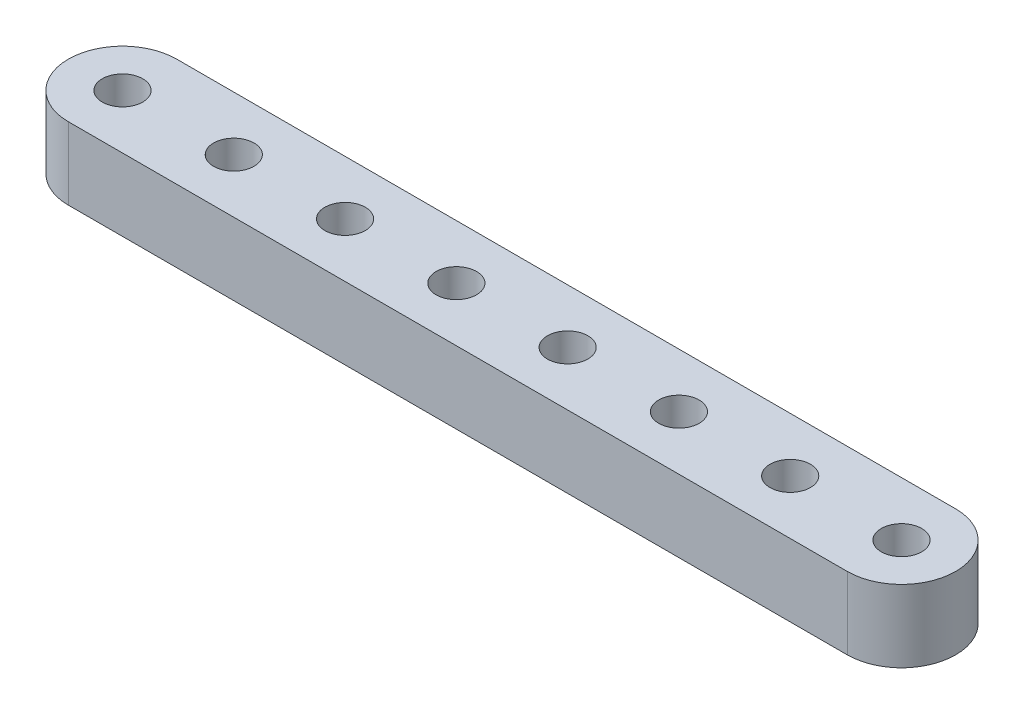
ISO-10303-21;
HEADER;
FILE_DESCRIPTION(('STEP AP214'),'2;1');
FILE_NAME('part.step','',(''),(''),'','','');
FILE_SCHEMA(('AUTOMOTIVE_DESIGN { 1 0 10303 214 1 1 1 1 }'));
ENDSEC;
DATA;
#1=APPLICATION_CONTEXT('core data for automotive mechanical design processes');
#2=APPLICATION_PROTOCOL_DEFINITION('international standard','automotive_design',2000,#1);
#3=PRODUCT_CONTEXT('',#1,'mechanical');
#4=PRODUCT('Part','Part','',(#3));
#5=PRODUCT_RELATED_PRODUCT_CATEGORY('part','',(#4));
#6=PRODUCT_DEFINITION_FORMATION('','',#4);
#7=PRODUCT_DEFINITION_CONTEXT('part definition',#1,'design');
#8=PRODUCT_DEFINITION('design','',#6,#7);
#9=PRODUCT_DEFINITION_SHAPE('','',#8);
#10=(LENGTH_UNIT() NAMED_UNIT(*) SI_UNIT(.MILLI.,.METRE.));
#11=(NAMED_UNIT(*) PLANE_ANGLE_UNIT() SI_UNIT($,.RADIAN.));
#12=(NAMED_UNIT(*) SI_UNIT($,.STERADIAN.) SOLID_ANGLE_UNIT());
#13=UNCERTAINTY_MEASURE_WITH_UNIT(LENGTH_MEASURE(1.E-05),#10,'distance_accuracy_value','');
#14=(GEOMETRIC_REPRESENTATION_CONTEXT(3) GLOBAL_UNCERTAINTY_ASSIGNED_CONTEXT((#13)) GLOBAL_UNIT_ASSIGNED_CONTEXT((#10,
#11,#12)) REPRESENTATION_CONTEXT('',''));
#15=CARTESIAN_POINT('',(0.,0.,0.));
#16=DIRECTION('',(0.,0.,1.));
#17=DIRECTION('',(1.,0.,0.));
#18=AXIS2_PLACEMENT_3D('',#15,#16,#17);
#19=CARTESIAN_POINT('',(39.116,6.35,4.76250000000001));
#20=DIRECTION('',(0.,0.,1.));
#21=DIRECTION('',(1.,0.,0.));
#22=AXIS2_PLACEMENT_3D('',#19,#20,#21);
#23=PLANE('',#22);
#24=DIRECTION('',(-1.,0.,0.));
#25=VECTOR('',#24,1.);
#26=CARTESIAN_POINT('',(39.116,6.35,4.76250000000001));
#27=LINE('',#26,#25);
#28=CARTESIAN_POINT('',(39.116,6.35,4.76250000000002));
#29=VERTEX_POINT('',#28);
#30=CARTESIAN_POINT('',(-29.337,6.35,4.76250000000001));
#31=VERTEX_POINT('',#30);
#32=EDGE_CURVE('E105',#29,#31,#27,.T.);
#33=ORIENTED_EDGE('',*,*,#32,.T.);
#34=DIRECTION('',(0.,1.,0.));
#35=VECTOR('',#34,1.);
#36=CARTESIAN_POINT('',(-29.337,0.,4.76250000000001));
#37=LINE('',#36,#35);
#38=CARTESIAN_POINT('',(-29.337,0.,4.76250000000001));
#39=VERTEX_POINT('',#38);
#40=EDGE_CURVE('E11',#31,#39,#37,.F.);
#41=ORIENTED_EDGE('',*,*,#40,.T.);
#42=DIRECTION('',(-1.,0.,0.));
#43=VECTOR('',#42,1.);
#44=CARTESIAN_POINT('',(39.116,0.,4.76250000000001));
#45=LINE('',#44,#43);
#46=CARTESIAN_POINT('',(39.116,0.,4.76250000000002));
#47=VERTEX_POINT('',#46);
#48=EDGE_CURVE('E96',#47,#39,#45,.T.);
#49=ORIENTED_EDGE('',*,*,#48,.F.);
#50=DIRECTION('',(0.,-1.,0.));
#51=VECTOR('',#50,1.);
#52=CARTESIAN_POINT('',(39.116,6.35,4.76250000000002));
#53=LINE('',#52,#51);
#54=EDGE_CURVE('E104',#29,#47,#53,.T.);
#55=ORIENTED_EDGE('',*,*,#54,.F.);
#56=EDGE_LOOP('',(#33,#41,#49,#55));
#57=FACE_BOUND('',#56,.T.);
#58=ADVANCED_FACE('F39',(#57),#23,.T.);
#59=CARTESIAN_POINT('',(39.116,6.35,0.));
#60=DIRECTION('',(0.,-1.,0.));
#61=DIRECTION('',(0.,0.,-1.));
#62=AXIS2_PLACEMENT_3D('',#59,#60,#61);
#63=CYLINDRICAL_SURFACE('',#62,4.76250000000001);
#64=CARTESIAN_POINT('',(39.116,0.,0.));
#65=DIRECTION('',(0.,-1.,0.));
#66=DIRECTION('',(0.,0.,-1.));
#67=AXIS2_PLACEMENT_3D('',#64,#65,#66);
#68=CIRCLE('',#67,4.76250000000001);
#69=CARTESIAN_POINT('',(39.116,0.,-4.76250000000001));
#70=VERTEX_POINT('',#69);
#71=EDGE_CURVE('E102',#70,#47,#68,.T.);
#72=ORIENTED_EDGE('',*,*,#71,.F.);
#73=DIRECTION('',(0.,-1.,0.));
#74=VECTOR('',#73,1.);
#75=CARTESIAN_POINT('',(39.116,6.35,-4.76250000000001));
#76=LINE('',#75,#74);
#77=CARTESIAN_POINT('',(39.116,6.35,-4.76250000000001));
#78=VERTEX_POINT('',#77);
#79=EDGE_CURVE('E89',#78,#70,#76,.T.);
#80=ORIENTED_EDGE('',*,*,#79,.F.);
#81=CARTESIAN_POINT('',(39.116,6.35,0.));
#82=DIRECTION('',(0.,-1.,0.));
#83=DIRECTION('',(0.,0.,-1.));
#84=AXIS2_PLACEMENT_3D('',#81,#82,#83);
#85=CIRCLE('',#84,4.76250000000001);
#86=EDGE_CURVE('E95',#78,#29,#85,.T.);
#87=ORIENTED_EDGE('',*,*,#86,.T.);
#88=ORIENTED_EDGE('',*,*,#54,.T.);
#89=EDGE_LOOP('',(#72,#80,#87,#88));
#90=FACE_BOUND('',#89,.T.);
#91=ADVANCED_FACE('F100',(#90),#63,.T.);
#92=CARTESIAN_POINT('',(-39.116,6.35,-4.76250000000001));
#93=DIRECTION('',(0.,0.,-1.));
#94=DIRECTION('',(-1.,0.,0.));
#95=AXIS2_PLACEMENT_3D('',#92,#93,#94);
#96=PLANE('',#95);
#97=DIRECTION('',(1.,0.,0.));
#98=VECTOR('',#97,1.);
#99=CARTESIAN_POINT('',(-39.116,0.,-4.76250000000001));
#100=LINE('',#99,#98);
#101=CARTESIAN_POINT('',(-29.337,0.,-4.76250000000001));
#102=VERTEX_POINT('',#101);
#103=EDGE_CURVE('E114',#102,#70,#100,.T.);
#104=ORIENTED_EDGE('',*,*,#103,.F.);
#105=DIRECTION('',(0.,-1.,0.));
#106=VECTOR('',#105,1.);
#107=CARTESIAN_POINT('',(-29.337,6.35,-4.76250000000001));
#108=LINE('',#107,#106);
#109=CARTESIAN_POINT('',(-29.337,6.35,-4.76250000000001));
#110=VERTEX_POINT('',#109);
#111=EDGE_CURVE('E92',#102,#110,#108,.F.);
#112=ORIENTED_EDGE('',*,*,#111,.T.);
#113=DIRECTION('',(1.,0.,0.));
#114=VECTOR('',#113,1.);
#115=CARTESIAN_POINT('',(-39.116,6.35,-4.76250000000001));
#116=LINE('',#115,#114);
#117=EDGE_CURVE('E85',#110,#78,#116,.T.);
#118=ORIENTED_EDGE('',*,*,#117,.T.);
#119=ORIENTED_EDGE('',*,*,#79,.T.);
#120=EDGE_LOOP('',(#104,#112,#118,#119));
#121=FACE_BOUND('',#120,.T.);
#122=ADVANCED_FACE('F88',(#121),#96,.T.);
#123=CARTESIAN_POINT('',(-39.116,6.35,0.));
#124=DIRECTION('',(0.,-1.,0.));
#125=DIRECTION('',(0.,0.,-1.));
#126=AXIS2_PLACEMENT_3D('',#123,#124,#125);
#127=PLANE('',#126);
#128=CARTESIAN_POINT('',(-29.337,6.35,0.));
#129=DIRECTION('',(0.,-1.,0.));
#130=DIRECTION('',(0.,0.,1.));
#131=AXIS2_PLACEMENT_3D('',#128,#129,#130);
#132=CIRCLE('',#131,1.77799999999999);
#133=CARTESIAN_POINT('',(-29.337,6.35,1.77799999999999));
#134=VERTEX_POINT('',#133);
#135=EDGE_CURVE('E150',#134,#134,#132,.T.);
#136=ORIENTED_EDGE('',*,*,#135,.T.);
#137=EDGE_LOOP('',(#136));
#138=FACE_BOUND('',#137,.T.);
#139=CARTESIAN_POINT('',(-19.558,6.35,0.));
#140=DIRECTION('',(0.,-1.,0.));
#141=DIRECTION('',(0.,0.,1.));
#142=AXIS2_PLACEMENT_3D('',#139,#140,#141);
#143=CIRCLE('',#142,1.77799999999999);
#144=CARTESIAN_POINT('',(-19.558,6.35,1.77799999999999));
#145=VERTEX_POINT('',#144);
#146=EDGE_CURVE('E159',#145,#145,#143,.T.);
#147=ORIENTED_EDGE('',*,*,#146,.T.);
#148=EDGE_LOOP('',(#147));
#149=FACE_BOUND('',#148,.T.);
#150=CARTESIAN_POINT('',(-9.779,6.35,0.));
#151=DIRECTION('',(0.,-1.,0.));
#152=DIRECTION('',(0.,0.,1.));
#153=AXIS2_PLACEMENT_3D('',#150,#151,#152);
#154=CIRCLE('',#153,1.77799999999999);
#155=CARTESIAN_POINT('',(-9.779,6.35,1.77799999999999));
#156=VERTEX_POINT('',#155);
#157=EDGE_CURVE('E167',#156,#156,#154,.T.);
#158=ORIENTED_EDGE('',*,*,#157,.T.);
#159=EDGE_LOOP('',(#158));
#160=FACE_BOUND('',#159,.T.);
#161=CARTESIAN_POINT('',(0.,6.35,0.));
#162=DIRECTION('',(0.,-1.,0.));
#163=DIRECTION('',(0.,0.,1.));
#164=AXIS2_PLACEMENT_3D('',#161,#162,#163);
#165=CIRCLE('',#164,1.77799999999999);
#166=CARTESIAN_POINT('',(0.,6.35,1.77799999999999));
#167=VERTEX_POINT('',#166);
#168=EDGE_CURVE('E175',#167,#167,#165,.T.);
#169=ORIENTED_EDGE('',*,*,#168,.T.);
#170=EDGE_LOOP('',(#169));
#171=FACE_BOUND('',#170,.T.);
#172=CARTESIAN_POINT('',(9.779,6.35,0.));
#173=DIRECTION('',(0.,-1.,0.));
#174=DIRECTION('',(0.,0.,1.));
#175=AXIS2_PLACEMENT_3D('',#172,#173,#174);
#176=CIRCLE('',#175,1.77799999999999);
#177=CARTESIAN_POINT('',(9.779,6.35,1.77799999999999));
#178=VERTEX_POINT('',#177);
#179=EDGE_CURVE('E183',#178,#178,#176,.T.);
#180=ORIENTED_EDGE('',*,*,#179,.T.);
#181=EDGE_LOOP('',(#180));
#182=FACE_BOUND('',#181,.T.);
#183=CARTESIAN_POINT('',(19.558,6.35,0.));
#184=DIRECTION('',(0.,-1.,0.));
#185=DIRECTION('',(0.,0.,1.));
#186=AXIS2_PLACEMENT_3D('',#183,#184,#185);
#187=CIRCLE('',#186,1.77799999999999);
#188=CARTESIAN_POINT('',(19.558,6.35,1.77799999999999));
#189=VERTEX_POINT('',#188);
#190=EDGE_CURVE('E191',#189,#189,#187,.T.);
#191=ORIENTED_EDGE('',*,*,#190,.T.);
#192=EDGE_LOOP('',(#191));
#193=FACE_BOUND('',#192,.T.);
#194=CARTESIAN_POINT('',(29.337,6.35,0.));
#195=DIRECTION('',(0.,-1.,0.));
#196=DIRECTION('',(0.,0.,1.));
#197=AXIS2_PLACEMENT_3D('',#194,#195,#196);
#198=CIRCLE('',#197,1.77799999999999);
#199=CARTESIAN_POINT('',(29.337,6.35,1.77799999999999));
#200=VERTEX_POINT('',#199);
#201=EDGE_CURVE('E199',#200,#200,#198,.T.);
#202=ORIENTED_EDGE('',*,*,#201,.T.);
#203=EDGE_LOOP('',(#202));
#204=FACE_BOUND('',#203,.T.);
#205=CARTESIAN_POINT('',(39.116,6.35,0.));
#206=DIRECTION('',(0.,-1.,0.));
#207=DIRECTION('',(0.,0.,1.));
#208=AXIS2_PLACEMENT_3D('',#205,#206,#207);
#209=CIRCLE('',#208,1.77799999999999);
#210=CARTESIAN_POINT('',(39.116,6.35,1.77799999999999));
#211=VERTEX_POINT('',#210);
#212=EDGE_CURVE('E117',#211,#211,#209,.T.);
#213=ORIENTED_EDGE('',*,*,#212,.T.);
#214=EDGE_LOOP('',(#213));
#215=FACE_BOUND('',#214,.T.);
#216=ORIENTED_EDGE('',*,*,#117,.F.);
#217=CARTESIAN_POINT('',(-29.337,6.35,0.));
#218=DIRECTION('',(0.,-1.,0.));
#219=DIRECTION('',(0.,0.,-1.));
#220=AXIS2_PLACEMENT_3D('',#217,#218,#219);
#221=CIRCLE('',#220,4.7625);
#222=CARTESIAN_POINT('',(-34.0995,6.35,0.));
#223=VERTEX_POINT('',#222);
#224=EDGE_CURVE('E49',#110,#223,#221,.F.);
#225=ORIENTED_EDGE('',*,*,#224,.T.);
#226=CARTESIAN_POINT('',(-29.337,6.35,0.));
#227=DIRECTION('',(0.,-1.,0.));
#228=DIRECTION('',(0.,0.,-1.));
#229=AXIS2_PLACEMENT_3D('',#226,#227,#228);
#230=CIRCLE('',#229,4.7625);
#231=EDGE_CURVE('E56',#223,#31,#230,.F.);
#232=ORIENTED_EDGE('',*,*,#231,.T.);
#233=ORIENTED_EDGE('',*,*,#32,.F.);
#234=ORIENTED_EDGE('',*,*,#86,.F.);
#235=EDGE_LOOP('',(#216,#225,#232,#233,#234));
#236=FACE_BOUND('',#235,.T.);
#237=ADVANCED_FACE('F107',(#138,#149,#160,#171,#182,#193,#204,#215,#236),#127,.F.);
#238=CARTESIAN_POINT('',(-39.116,0.,0.));
#239=DIRECTION('',(0.,-1.,0.));
#240=DIRECTION('',(0.,0.,-1.));
#241=AXIS2_PLACEMENT_3D('',#238,#239,#240);
#242=PLANE('',#241);
#243=CARTESIAN_POINT('',(-29.337,0.,0.));
#244=DIRECTION('',(0.,-1.,0.));
#245=DIRECTION('',(0.,0.,-1.));
#246=AXIS2_PLACEMENT_3D('',#243,#244,#245);
#247=CIRCLE('',#246,4.7625);
#248=CARTESIAN_POINT('',(-34.0995,0.,0.));
#249=VERTEX_POINT('',#248);
#250=EDGE_CURVE('E124',#39,#249,#247,.T.);
#251=ORIENTED_EDGE('',*,*,#250,.T.);
#252=CARTESIAN_POINT('',(-29.337,0.,0.));
#253=DIRECTION('',(0.,-1.,0.));
#254=DIRECTION('',(0.,0.,-1.));
#255=AXIS2_PLACEMENT_3D('',#252,#253,#254);
#256=CIRCLE('',#255,4.7625);
#257=EDGE_CURVE('E128',#249,#102,#256,.T.);
#258=ORIENTED_EDGE('',*,*,#257,.T.);
#259=ORIENTED_EDGE('',*,*,#103,.T.);
#260=ORIENTED_EDGE('',*,*,#71,.T.);
#261=ORIENTED_EDGE('',*,*,#48,.T.);
#262=EDGE_LOOP('',(#251,#258,#259,#260,#261));
#263=FACE_BOUND('',#262,.T.);
#264=CARTESIAN_POINT('',(-29.337,0.,0.));
#265=DIRECTION('',(0.,-1.,0.));
#266=DIRECTION('',(0.,0.,1.));
#267=AXIS2_PLACEMENT_3D('',#264,#265,#266);
#268=CIRCLE('',#267,1.77799999999999);
#269=CARTESIAN_POINT('',(-29.337,0.,1.77799999999999));
#270=VERTEX_POINT('',#269);
#271=EDGE_CURVE('E147',#270,#270,#268,.T.);
#272=ORIENTED_EDGE('',*,*,#271,.F.);
#273=EDGE_LOOP('',(#272));
#274=FACE_BOUND('',#273,.T.);
#275=CARTESIAN_POINT('',(-19.558,0.,0.));
#276=DIRECTION('',(0.,-1.,0.));
#277=DIRECTION('',(0.,0.,1.));
#278=AXIS2_PLACEMENT_3D('',#275,#276,#277);
#279=CIRCLE('',#278,1.77799999999999);
#280=CARTESIAN_POINT('',(-19.558,0.,1.77799999999999));
#281=VERTEX_POINT('',#280);
#282=EDGE_CURVE('E156',#281,#281,#279,.T.);
#283=ORIENTED_EDGE('',*,*,#282,.F.);
#284=EDGE_LOOP('',(#283));
#285=FACE_BOUND('',#284,.T.);
#286=CARTESIAN_POINT('',(-9.779,0.,0.));
#287=DIRECTION('',(0.,-1.,0.));
#288=DIRECTION('',(0.,0.,1.));
#289=AXIS2_PLACEMENT_3D('',#286,#287,#288);
#290=CIRCLE('',#289,1.77799999999999);
#291=CARTESIAN_POINT('',(-9.779,0.,1.77799999999999));
#292=VERTEX_POINT('',#291);
#293=EDGE_CURVE('E163',#292,#292,#290,.T.);
#294=ORIENTED_EDGE('',*,*,#293,.F.);
#295=EDGE_LOOP('',(#294));
#296=FACE_BOUND('',#295,.T.);
#297=CARTESIAN_POINT('',(0.,0.,0.));
#298=DIRECTION('',(0.,-1.,0.));
#299=DIRECTION('',(0.,0.,1.));
#300=AXIS2_PLACEMENT_3D('',#297,#298,#299);
#301=CIRCLE('',#300,1.77799999999999);
#302=CARTESIAN_POINT('',(0.,0.,1.77799999999999));
#303=VERTEX_POINT('',#302);
#304=EDGE_CURVE('E171',#303,#303,#301,.T.);
#305=ORIENTED_EDGE('',*,*,#304,.F.);
#306=EDGE_LOOP('',(#305));
#307=FACE_BOUND('',#306,.T.);
#308=CARTESIAN_POINT('',(9.779,0.,0.));
#309=DIRECTION('',(0.,-1.,0.));
#310=DIRECTION('',(0.,0.,1.));
#311=AXIS2_PLACEMENT_3D('',#308,#309,#310);
#312=CIRCLE('',#311,1.77799999999999);
#313=CARTESIAN_POINT('',(9.779,0.,1.77799999999999));
#314=VERTEX_POINT('',#313);
#315=EDGE_CURVE('E179',#314,#314,#312,.T.);
#316=ORIENTED_EDGE('',*,*,#315,.F.);
#317=EDGE_LOOP('',(#316));
#318=FACE_BOUND('',#317,.T.);
#319=CARTESIAN_POINT('',(19.558,0.,0.));
#320=DIRECTION('',(0.,-1.,0.));
#321=DIRECTION('',(0.,0.,1.));
#322=AXIS2_PLACEMENT_3D('',#319,#320,#321);
#323=CIRCLE('',#322,1.77799999999999);
#324=CARTESIAN_POINT('',(19.558,0.,1.77799999999999));
#325=VERTEX_POINT('',#324);
#326=EDGE_CURVE('E187',#325,#325,#323,.T.);
#327=ORIENTED_EDGE('',*,*,#326,.F.);
#328=EDGE_LOOP('',(#327));
#329=FACE_BOUND('',#328,.T.);
#330=CARTESIAN_POINT('',(29.337,0.,0.));
#331=DIRECTION('',(0.,-1.,0.));
#332=DIRECTION('',(0.,0.,1.));
#333=AXIS2_PLACEMENT_3D('',#330,#331,#332);
#334=CIRCLE('',#333,1.77799999999999);
#335=CARTESIAN_POINT('',(29.337,0.,1.77799999999999));
#336=VERTEX_POINT('',#335);
#337=EDGE_CURVE('E195',#336,#336,#334,.T.);
#338=ORIENTED_EDGE('',*,*,#337,.F.);
#339=EDGE_LOOP('',(#338));
#340=FACE_BOUND('',#339,.T.);
#341=CARTESIAN_POINT('',(39.116,0.,0.));
#342=DIRECTION('',(0.,-1.,0.));
#343=DIRECTION('',(0.,0.,1.));
#344=AXIS2_PLACEMENT_3D('',#341,#342,#343);
#345=CIRCLE('',#344,1.77799999999999);
#346=CARTESIAN_POINT('',(39.116,0.,1.77799999999999));
#347=VERTEX_POINT('',#346);
#348=EDGE_CURVE('E203',#347,#347,#345,.T.);
#349=ORIENTED_EDGE('',*,*,#348,.F.);
#350=EDGE_LOOP('',(#349));
#351=FACE_BOUND('',#350,.T.);
#352=ADVANCED_FACE('F138',(#263,#274,#285,#296,#307,#318,#329,#340,#351),#242,.T.);
#353=CARTESIAN_POINT('',(39.116,6.35,0.));
#354=DIRECTION('',(0.,-1.,0.));
#355=DIRECTION('',(0.,0.,-1.));
#356=AXIS2_PLACEMENT_3D('',#353,#354,#355);
#357=CYLINDRICAL_SURFACE('',#356,1.77799999999999);
#358=ORIENTED_EDGE('',*,*,#212,.F.);
#359=EDGE_LOOP('',(#358));
#360=FACE_BOUND('',#359,.T.);
#361=ORIENTED_EDGE('',*,*,#348,.T.);
#362=EDGE_LOOP('',(#361));
#363=FACE_BOUND('',#362,.T.);
#364=ADVANCED_FACE('F213',(#360,#363),#357,.F.);
#365=CARTESIAN_POINT('',(29.337,6.35,0.));
#366=DIRECTION('',(0.,-1.,0.));
#367=DIRECTION('',(0.,0.,-1.));
#368=AXIS2_PLACEMENT_3D('',#365,#366,#367);
#369=CYLINDRICAL_SURFACE('',#368,1.77799999999999);
#370=ORIENTED_EDGE('',*,*,#201,.F.);
#371=EDGE_LOOP('',(#370));
#372=FACE_BOUND('',#371,.T.);
#373=ORIENTED_EDGE('',*,*,#337,.T.);
#374=EDGE_LOOP('',(#373));
#375=FACE_BOUND('',#374,.T.);
#376=ADVANCED_FACE('F222',(#372,#375),#369,.F.);
#377=CARTESIAN_POINT('',(19.558,6.35,0.));
#378=DIRECTION('',(0.,-1.,0.));
#379=DIRECTION('',(0.,0.,-1.));
#380=AXIS2_PLACEMENT_3D('',#377,#378,#379);
#381=CYLINDRICAL_SURFACE('',#380,1.77799999999999);
#382=ORIENTED_EDGE('',*,*,#190,.F.);
#383=EDGE_LOOP('',(#382));
#384=FACE_BOUND('',#383,.T.);
#385=ORIENTED_EDGE('',*,*,#326,.T.);
#386=EDGE_LOOP('',(#385));
#387=FACE_BOUND('',#386,.T.);
#388=ADVANCED_FACE('F266',(#384,#387),#381,.F.);
#389=CARTESIAN_POINT('',(9.779,6.35,0.));
#390=DIRECTION('',(0.,-1.,0.));
#391=DIRECTION('',(0.,0.,-1.));
#392=AXIS2_PLACEMENT_3D('',#389,#390,#391);
#393=CYLINDRICAL_SURFACE('',#392,1.77799999999999);
#394=ORIENTED_EDGE('',*,*,#179,.F.);
#395=EDGE_LOOP('',(#394));
#396=FACE_BOUND('',#395,.T.);
#397=ORIENTED_EDGE('',*,*,#315,.T.);
#398=EDGE_LOOP('',(#397));
#399=FACE_BOUND('',#398,.T.);
#400=ADVANCED_FACE('F262',(#396,#399),#393,.F.);
#401=CARTESIAN_POINT('',(0.,6.35,0.));
#402=DIRECTION('',(0.,-1.,0.));
#403=DIRECTION('',(0.,0.,-1.));
#404=AXIS2_PLACEMENT_3D('',#401,#402,#403);
#405=CYLINDRICAL_SURFACE('',#404,1.77799999999999);
#406=ORIENTED_EDGE('',*,*,#168,.F.);
#407=EDGE_LOOP('',(#406));
#408=FACE_BOUND('',#407,.T.);
#409=ORIENTED_EDGE('',*,*,#304,.T.);
#410=EDGE_LOOP('',(#409));
#411=FACE_BOUND('',#410,.T.);
#412=ADVANCED_FACE('F258',(#408,#411),#405,.F.);
#413=CARTESIAN_POINT('',(-9.779,6.35,0.));
#414=DIRECTION('',(0.,-1.,0.));
#415=DIRECTION('',(0.,0.,-1.));
#416=AXIS2_PLACEMENT_3D('',#413,#414,#415);
#417=CYLINDRICAL_SURFACE('',#416,1.77799999999999);
#418=ORIENTED_EDGE('',*,*,#157,.F.);
#419=EDGE_LOOP('',(#418));
#420=FACE_BOUND('',#419,.T.);
#421=ORIENTED_EDGE('',*,*,#293,.T.);
#422=EDGE_LOOP('',(#421));
#423=FACE_BOUND('',#422,.T.);
#424=ADVANCED_FACE('F251',(#420,#423),#417,.F.);
#425=CARTESIAN_POINT('',(-19.558,6.35,0.));
#426=DIRECTION('',(0.,-1.,0.));
#427=DIRECTION('',(0.,0.,-1.));
#428=AXIS2_PLACEMENT_3D('',#425,#426,#427);
#429=CYLINDRICAL_SURFACE('',#428,1.77799999999999);
#430=ORIENTED_EDGE('',*,*,#146,.F.);
#431=EDGE_LOOP('',(#430));
#432=FACE_BOUND('',#431,.T.);
#433=ORIENTED_EDGE('',*,*,#282,.T.);
#434=EDGE_LOOP('',(#433));
#435=FACE_BOUND('',#434,.T.);
#436=ADVANCED_FACE('F244',(#432,#435),#429,.F.);
#437=CARTESIAN_POINT('',(-29.337,6.35,0.));
#438=DIRECTION('',(0.,-1.,0.));
#439=DIRECTION('',(0.,0.,-1.));
#440=AXIS2_PLACEMENT_3D('',#437,#438,#439);
#441=CYLINDRICAL_SURFACE('',#440,1.77799999999999);
#442=ORIENTED_EDGE('',*,*,#135,.F.);
#443=EDGE_LOOP('',(#442));
#444=FACE_BOUND('',#443,.T.);
#445=ORIENTED_EDGE('',*,*,#271,.T.);
#446=EDGE_LOOP('',(#445));
#447=FACE_BOUND('',#446,.T.);
#448=ADVANCED_FACE('F241',(#444,#447),#441,.F.);
#449=CARTESIAN_POINT('',(-29.337,0.,0.));
#450=DIRECTION('',(0.,-1.,0.));
#451=DIRECTION('',(0.,0.,-1.));
#452=AXIS2_PLACEMENT_3D('',#449,#450,#451);
#453=CYLINDRICAL_SURFACE('',#452,4.7625);
#454=ORIENTED_EDGE('',*,*,#40,.F.);
#455=ORIENTED_EDGE('',*,*,#231,.F.);
#456=DIRECTION('',(0.,1.,0.));
#457=VECTOR('',#456,1.);
#458=CARTESIAN_POINT('',(-34.0995,6.35,0.));
#459=LINE('',#458,#457);
#460=EDGE_CURVE('E43',#249,#223,#459,.T.);
#461=ORIENTED_EDGE('',*,*,#460,.F.);
#462=ORIENTED_EDGE('',*,*,#250,.F.);
#463=EDGE_LOOP('',(#454,#455,#461,#462));
#464=FACE_BOUND('',#463,.T.);
#465=ADVANCED_FACE('F41',(#464),#453,.T.);
#466=CARTESIAN_POINT('',(-29.337,0.,0.));
#467=DIRECTION('',(0.,1.,0.));
#468=DIRECTION('',(0.,0.,1.));
#469=AXIS2_PLACEMENT_3D('',#466,#467,#468);
#470=CYLINDRICAL_SURFACE('',#469,4.7625);
#471=ORIENTED_EDGE('',*,*,#224,.F.);
#472=ORIENTED_EDGE('',*,*,#111,.F.);
#473=ORIENTED_EDGE('',*,*,#257,.F.);
#474=ORIENTED_EDGE('',*,*,#460,.T.);
#475=EDGE_LOOP('',(#471,#472,#473,#474));
#476=FACE_BOUND('',#475,.T.);
#477=ADVANCED_FACE('F144',(#476),#470,.T.);
#478=CLOSED_SHELL('',(#58,#91,#122,#237,#352,#364,#376,#388,#400,#412,#424,#436,#448,#465,#477));
#479=MANIFOLD_SOLID_BREP('B2',#478);
#480=ADVANCED_BREP_SHAPE_REPRESENTATION('',(#18,#479),#14);
#481=SHAPE_DEFINITION_REPRESENTATION(#9,#480);
ENDSEC;
END-ISO-10303-21;
